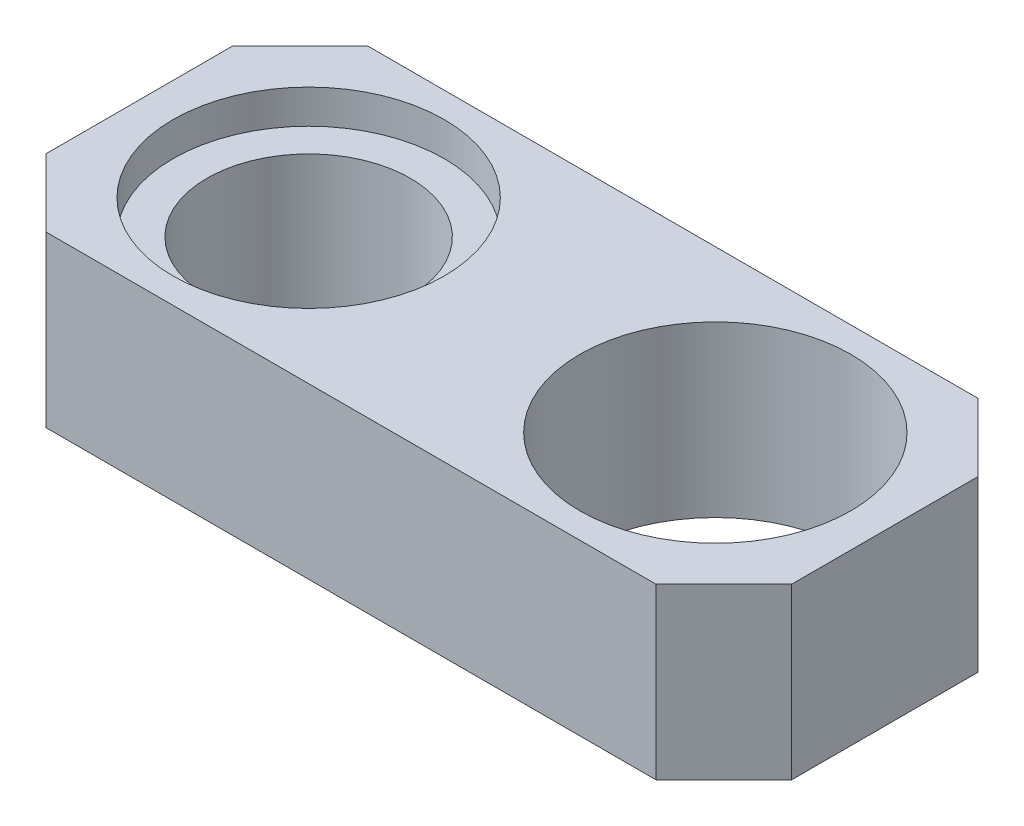
ISO-10303-21;
HEADER;
FILE_DESCRIPTION(('STEP AP214'),'2;1');
FILE_NAME('part.step','',(''),(''),'','','');
FILE_SCHEMA(('AUTOMOTIVE_DESIGN { 1 0 10303 214 1 1 1 1 }'));
ENDSEC;
DATA;
#1=APPLICATION_CONTEXT('core data for automotive mechanical design processes');
#2=APPLICATION_PROTOCOL_DEFINITION('international standard','automotive_design',2000,#1);
#3=PRODUCT_CONTEXT('',#1,'mechanical');
#4=PRODUCT('Part','Part','',(#3));
#5=PRODUCT_RELATED_PRODUCT_CATEGORY('part','',(#4));
#6=PRODUCT_DEFINITION_FORMATION('','',#4);
#7=PRODUCT_DEFINITION_CONTEXT('part definition',#1,'design');
#8=PRODUCT_DEFINITION('design','',#6,#7);
#9=PRODUCT_DEFINITION_SHAPE('','',#8);
#10=(LENGTH_UNIT() NAMED_UNIT(*) SI_UNIT(.MILLI.,.METRE.));
#11=(NAMED_UNIT(*) PLANE_ANGLE_UNIT() SI_UNIT($,.RADIAN.));
#12=(NAMED_UNIT(*) SI_UNIT($,.STERADIAN.) SOLID_ANGLE_UNIT());
#13=UNCERTAINTY_MEASURE_WITH_UNIT(LENGTH_MEASURE(1.E-05),#10,'distance_accuracy_value','');
#14=(GEOMETRIC_REPRESENTATION_CONTEXT(3) GLOBAL_UNCERTAINTY_ASSIGNED_CONTEXT((#13)) GLOBAL_UNIT_ASSIGNED_CONTEXT((#10,
#11,#12)) REPRESENTATION_CONTEXT('',''));
#15=CARTESIAN_POINT('',(0.,0.,0.));
#16=DIRECTION('',(0.,0.,1.));
#17=DIRECTION('',(1.,0.,0.));
#18=AXIS2_PLACEMENT_3D('',#15,#16,#17);
#19=CARTESIAN_POINT('',(-11.,2.5,4.75));
#20=DIRECTION('',(1.,0.,0.));
#21=DIRECTION('',(0.,0.,-1.));
#22=AXIS2_PLACEMENT_3D('',#19,#20,#21);
#23=PLANE('',#22);
#24=DIRECTION('',(0.,0.,1.));
#25=VECTOR('',#24,1.);
#26=CARTESIAN_POINT('',(-11.,2.5,4.75));
#27=LINE('',#26,#25);
#28=CARTESIAN_POINT('',(-11.,2.5,-2.75));
#29=VERTEX_POINT('',#28);
#30=CARTESIAN_POINT('',(-11.,2.5,2.74999999999999));
#31=VERTEX_POINT('',#30);
#32=EDGE_CURVE('E128',#29,#31,#27,.T.);
#33=ORIENTED_EDGE('',*,*,#32,.F.);
#34=DIRECTION('',(0.,-1.,0.));
#35=VECTOR('',#34,1.);
#36=CARTESIAN_POINT('',(-11.,2.5,-2.75));
#37=LINE('',#36,#35);
#38=CARTESIAN_POINT('',(-11.,-2.5,-2.75));
#39=VERTEX_POINT('',#38);
#40=EDGE_CURVE('E113',#29,#39,#37,.T.);
#41=ORIENTED_EDGE('',*,*,#40,.T.);
#42=DIRECTION('',(0.,0.,1.));
#43=VECTOR('',#42,1.);
#44=CARTESIAN_POINT('',(-11.,-2.5,4.75));
#45=LINE('',#44,#43);
#46=CARTESIAN_POINT('',(-11.,-2.5,2.74999999999999));
#47=VERTEX_POINT('',#46);
#48=EDGE_CURVE('E130',#39,#47,#45,.T.);
#49=ORIENTED_EDGE('',*,*,#48,.T.);
#50=DIRECTION('',(0.,1.,0.));
#51=VECTOR('',#50,1.);
#52=CARTESIAN_POINT('',(-11.,2.5,2.74999999999999));
#53=LINE('',#52,#51);
#54=EDGE_CURVE('E132',#47,#31,#53,.T.);
#55=ORIENTED_EDGE('',*,*,#54,.T.);
#56=EDGE_LOOP('',(#33,#41,#49,#55));
#57=FACE_BOUND('',#56,.T.);
#58=ADVANCED_FACE('F42',(#57),#23,.F.);
#59=CARTESIAN_POINT('',(11.,2.5,4.75));
#60=DIRECTION('',(0.,0.,-1.));
#61=DIRECTION('',(-1.,0.,0.));
#62=AXIS2_PLACEMENT_3D('',#59,#60,#61);
#63=PLANE('',#62);
#64=DIRECTION('',(1.,0.,0.));
#65=VECTOR('',#64,1.);
#66=CARTESIAN_POINT('',(11.,2.5,4.75));
#67=LINE('',#66,#65);
#68=CARTESIAN_POINT('',(-9.,2.5,4.75));
#69=VERTEX_POINT('',#68);
#70=CARTESIAN_POINT('',(8.99999999999999,2.5,4.75));
#71=VERTEX_POINT('',#70);
#72=EDGE_CURVE('E177',#69,#71,#67,.T.);
#73=ORIENTED_EDGE('',*,*,#72,.F.);
#74=DIRECTION('',(0.,-1.,0.));
#75=VECTOR('',#74,1.);
#76=CARTESIAN_POINT('',(-9.,2.5,4.75));
#77=LINE('',#76,#75);
#78=CARTESIAN_POINT('',(-9.,-2.5,4.75));
#79=VERTEX_POINT('',#78);
#80=EDGE_CURVE('E166',#69,#79,#77,.T.);
#81=ORIENTED_EDGE('',*,*,#80,.T.);
#82=DIRECTION('',(1.,0.,0.));
#83=VECTOR('',#82,1.);
#84=CARTESIAN_POINT('',(11.,-2.5,4.75));
#85=LINE('',#84,#83);
#86=CARTESIAN_POINT('',(8.99999999999999,-2.5,4.75));
#87=VERTEX_POINT('',#86);
#88=EDGE_CURVE('E137',#79,#87,#85,.T.);
#89=ORIENTED_EDGE('',*,*,#88,.T.);
#90=DIRECTION('',(0.,1.,0.));
#91=VECTOR('',#90,1.);
#92=CARTESIAN_POINT('',(8.99999999999999,2.5,4.75));
#93=LINE('',#92,#91);
#94=EDGE_CURVE('E170',#87,#71,#93,.T.);
#95=ORIENTED_EDGE('',*,*,#94,.T.);
#96=EDGE_LOOP('',(#73,#81,#89,#95));
#97=FACE_BOUND('',#96,.T.);
#98=ADVANCED_FACE('F173',(#97),#63,.F.);
#99=CARTESIAN_POINT('',(11.,2.5,4.75));
#100=DIRECTION('',(-1.,0.,0.));
#101=DIRECTION('',(0.,0.,1.));
#102=AXIS2_PLACEMENT_3D('',#99,#100,#101);
#103=PLANE('',#102);
#104=DIRECTION('',(0.,0.,-1.));
#105=VECTOR('',#104,1.);
#106=CARTESIAN_POINT('',(11.,2.5,4.75));
#107=LINE('',#106,#105);
#108=CARTESIAN_POINT('',(11.,2.5,2.75));
#109=VERTEX_POINT('',#108);
#110=CARTESIAN_POINT('',(11.,2.5,-2.75));
#111=VERTEX_POINT('',#110);
#112=EDGE_CURVE('E184',#109,#111,#107,.T.);
#113=ORIENTED_EDGE('',*,*,#112,.F.);
#114=DIRECTION('',(0.,-1.,0.));
#115=VECTOR('',#114,1.);
#116=CARTESIAN_POINT('',(11.,2.5,2.75));
#117=LINE('',#116,#115);
#118=CARTESIAN_POINT('',(11.,-2.5,2.75));
#119=VERTEX_POINT('',#118);
#120=EDGE_CURVE('E11',#109,#119,#117,.T.);
#121=ORIENTED_EDGE('',*,*,#120,.T.);
#122=DIRECTION('',(0.,0.,-1.));
#123=VECTOR('',#122,1.);
#124=CARTESIAN_POINT('',(11.,-2.5,4.75));
#125=LINE('',#124,#123);
#126=CARTESIAN_POINT('',(11.,-2.5,-2.75));
#127=VERTEX_POINT('',#126);
#128=EDGE_CURVE('E138',#119,#127,#125,.T.);
#129=ORIENTED_EDGE('',*,*,#128,.T.);
#130=DIRECTION('',(0.,1.,0.));
#131=VECTOR('',#130,1.);
#132=CARTESIAN_POINT('',(11.,2.5,-2.75));
#133=LINE('',#132,#131);
#134=EDGE_CURVE('E52',#127,#111,#133,.T.);
#135=ORIENTED_EDGE('',*,*,#134,.T.);
#136=EDGE_LOOP('',(#113,#121,#129,#135));
#137=FACE_BOUND('',#136,.T.);
#138=ADVANCED_FACE('F181',(#137),#103,.F.);
#139=CARTESIAN_POINT('',(11.,2.5,-4.75));
#140=DIRECTION('',(0.,0.,1.));
#141=DIRECTION('',(1.,0.,0.));
#142=AXIS2_PLACEMENT_3D('',#139,#140,#141);
#143=PLANE('',#142);
#144=DIRECTION('',(-1.,0.,0.));
#145=VECTOR('',#144,1.);
#146=CARTESIAN_POINT('',(11.,-2.5,-4.75));
#147=LINE('',#146,#145);
#148=CARTESIAN_POINT('',(9.,-2.5,-4.75));
#149=VERTEX_POINT('',#148);
#150=CARTESIAN_POINT('',(-8.99999999999999,-2.5,-4.75));
#151=VERTEX_POINT('',#150);
#152=EDGE_CURVE('E147',#149,#151,#147,.T.);
#153=ORIENTED_EDGE('',*,*,#152,.T.);
#154=DIRECTION('',(0.,1.,0.));
#155=VECTOR('',#154,1.);
#156=CARTESIAN_POINT('',(-8.99999999999999,2.5,-4.75));
#157=LINE('',#156,#155);
#158=CARTESIAN_POINT('',(-8.99999999999999,2.5,-4.75));
#159=VERTEX_POINT('',#158);
#160=EDGE_CURVE('E116',#151,#159,#157,.T.);
#161=ORIENTED_EDGE('',*,*,#160,.T.);
#162=DIRECTION('',(-1.,0.,0.));
#163=VECTOR('',#162,1.);
#164=CARTESIAN_POINT('',(11.,2.5,-4.75));
#165=LINE('',#164,#163);
#166=CARTESIAN_POINT('',(9.,2.5,-4.75));
#167=VERTEX_POINT('',#166);
#168=EDGE_CURVE('E148',#167,#159,#165,.T.);
#169=ORIENTED_EDGE('',*,*,#168,.F.);
#170=DIRECTION('',(0.,-1.,0.));
#171=VECTOR('',#170,1.);
#172=CARTESIAN_POINT('',(9.,2.5,-4.75));
#173=LINE('',#172,#171);
#174=EDGE_CURVE('E122',#167,#149,#173,.T.);
#175=ORIENTED_EDGE('',*,*,#174,.T.);
#176=EDGE_LOOP('',(#153,#161,#169,#175));
#177=FACE_BOUND('',#176,.T.);
#178=ADVANCED_FACE('F228',(#177),#143,.F.);
#179=CARTESIAN_POINT('',(0.,2.5,0.));
#180=DIRECTION('',(0.,1.,0.));
#181=DIRECTION('',(0.,0.,1.));
#182=AXIS2_PLACEMENT_3D('',#179,#180,#181);
#183=PLANE('',#182);
#184=CARTESIAN_POINT('',(-6.,2.5,0.));
#185=DIRECTION('',(0.,1.,0.));
#186=DIRECTION('',(0.,0.,1.));
#187=AXIS2_PLACEMENT_3D('',#184,#185,#186);
#188=CIRCLE('',#187,4.);
#189=CARTESIAN_POINT('',(-6.,2.5,4.));
#190=VERTEX_POINT('',#189);
#191=EDGE_CURVE('E194',#190,#190,#188,.T.);
#192=ORIENTED_EDGE('',*,*,#191,.F.);
#193=EDGE_LOOP('',(#192));
#194=FACE_BOUND('',#193,.T.);
#195=CARTESIAN_POINT('',(6.,2.5,0.));
#196=DIRECTION('',(0.,1.,0.));
#197=DIRECTION('',(0.,0.,1.));
#198=AXIS2_PLACEMENT_3D('',#195,#196,#197);
#199=CIRCLE('',#198,4.);
#200=CARTESIAN_POINT('',(6.,2.5,4.));
#201=VERTEX_POINT('',#200);
#202=EDGE_CURVE('E141',#201,#201,#199,.T.);
#203=ORIENTED_EDGE('',*,*,#202,.F.);
#204=EDGE_LOOP('',(#203));
#205=FACE_BOUND('',#204,.T.);
#206=ORIENTED_EDGE('',*,*,#168,.T.);
#207=DIRECTION('',(0.707106781186549,0.,-0.707106781186546));
#208=VECTOR('',#207,1.);
#209=CARTESIAN_POINT('',(-6.87499999999998,2.5,-6.875));
#210=LINE('',#209,#208);
#211=EDGE_CURVE('E164',#159,#29,#210,.F.);
#212=ORIENTED_EDGE('',*,*,#211,.T.);
#213=ORIENTED_EDGE('',*,*,#32,.T.);
#214=DIRECTION('',(-0.707106781186546,0.,-0.707106781186549));
#215=VECTOR('',#214,1.);
#216=CARTESIAN_POINT('',(-6.87500000000002,2.5,6.87499999999999));
#217=LINE('',#216,#215);
#218=EDGE_CURVE('E162',#31,#69,#217,.F.);
#219=ORIENTED_EDGE('',*,*,#218,.T.);
#220=ORIENTED_EDGE('',*,*,#72,.T.);
#221=DIRECTION('',(-0.707106781186549,0.,0.707106781186546));
#222=VECTOR('',#221,1.);
#223=CARTESIAN_POINT('',(6.87499999999998,2.5,6.87500000000001));
#224=LINE('',#223,#222);
#225=EDGE_CURVE('E67',#71,#109,#224,.F.);
#226=ORIENTED_EDGE('',*,*,#225,.T.);
#227=ORIENTED_EDGE('',*,*,#112,.T.);
#228=DIRECTION('',(0.707106781186546,0.,0.707106781186549));
#229=VECTOR('',#228,1.);
#230=CARTESIAN_POINT('',(6.87500000000002,2.5,-6.87499999999999));
#231=LINE('',#230,#229);
#232=EDGE_CURVE('E159',#111,#167,#231,.F.);
#233=ORIENTED_EDGE('',*,*,#232,.T.);
#234=EDGE_LOOP('',(#206,#212,#213,#219,#220,#226,#227,#233));
#235=FACE_BOUND('',#234,.T.);
#236=ADVANCED_FACE('F226',(#194,#205,#235),#183,.T.);
#237=CARTESIAN_POINT('',(0.,-2.5,0.));
#238=DIRECTION('',(0.,1.,0.));
#239=DIRECTION('',(0.,0.,1.));
#240=AXIS2_PLACEMENT_3D('',#237,#238,#239);
#241=PLANE('',#240);
#242=CARTESIAN_POINT('',(-6.,-2.5,0.));
#243=DIRECTION('',(0.,1.,0.));
#244=DIRECTION('',(0.,0.,1.));
#245=AXIS2_PLACEMENT_3D('',#242,#243,#244);
#246=CIRCLE('',#245,3.);
#247=CARTESIAN_POINT('',(-6.,-2.5,3.));
#248=VERTEX_POINT('',#247);
#249=EDGE_CURVE('E198',#248,#248,#246,.T.);
#250=ORIENTED_EDGE('',*,*,#249,.T.);
#251=EDGE_LOOP('',(#250));
#252=FACE_BOUND('',#251,.T.);
#253=CARTESIAN_POINT('',(6.,-2.5,0.));
#254=DIRECTION('',(0.,1.,0.));
#255=DIRECTION('',(0.,0.,1.));
#256=AXIS2_PLACEMENT_3D('',#253,#254,#255);
#257=CIRCLE('',#256,4.);
#258=CARTESIAN_POINT('',(6.,-2.5,4.));
#259=VERTEX_POINT('',#258);
#260=EDGE_CURVE('E140',#259,#259,#257,.T.);
#261=ORIENTED_EDGE('',*,*,#260,.T.);
#262=EDGE_LOOP('',(#261));
#263=FACE_BOUND('',#262,.T.);
#264=ORIENTED_EDGE('',*,*,#48,.F.);
#265=DIRECTION('',(-0.707106781186549,0.,0.707106781186546));
#266=VECTOR('',#265,1.);
#267=CARTESIAN_POINT('',(-11.,-2.5,-2.75));
#268=LINE('',#267,#266);
#269=EDGE_CURVE('E112',#39,#151,#268,.F.);
#270=ORIENTED_EDGE('',*,*,#269,.T.);
#271=ORIENTED_EDGE('',*,*,#152,.F.);
#272=DIRECTION('',(-0.707106781186546,0.,-0.707106781186549));
#273=VECTOR('',#272,1.);
#274=CARTESIAN_POINT('',(9.,-2.5,-4.75));
#275=LINE('',#274,#273);
#276=EDGE_CURVE('E131',#149,#127,#275,.F.);
#277=ORIENTED_EDGE('',*,*,#276,.T.);
#278=ORIENTED_EDGE('',*,*,#128,.F.);
#279=DIRECTION('',(0.707106781186549,0.,-0.707106781186546));
#280=VECTOR('',#279,1.);
#281=CARTESIAN_POINT('',(11.,-2.5,2.75));
#282=LINE('',#281,#280);
#283=EDGE_CURVE('E152',#119,#87,#282,.F.);
#284=ORIENTED_EDGE('',*,*,#283,.T.);
#285=ORIENTED_EDGE('',*,*,#88,.F.);
#286=DIRECTION('',(0.707106781186546,0.,0.707106781186549));
#287=VECTOR('',#286,1.);
#288=CARTESIAN_POINT('',(-9.,-2.5,4.75));
#289=LINE('',#288,#287);
#290=EDGE_CURVE('E125',#79,#47,#289,.F.);
#291=ORIENTED_EDGE('',*,*,#290,.T.);
#292=EDGE_LOOP('',(#264,#270,#271,#277,#278,#284,#285,#291));
#293=FACE_BOUND('',#292,.T.);
#294=ADVANCED_FACE('F133',(#252,#263,#293),#241,.F.);
#295=CARTESIAN_POINT('',(6.,-2.5,0.));
#296=DIRECTION('',(0.,1.,0.));
#297=DIRECTION('',(0.,0.,1.));
#298=AXIS2_PLACEMENT_3D('',#295,#296,#297);
#299=CYLINDRICAL_SURFACE('',#298,4.);
#300=ORIENTED_EDGE('',*,*,#260,.F.);
#301=EDGE_LOOP('',(#300));
#302=FACE_BOUND('',#301,.T.);
#303=ORIENTED_EDGE('',*,*,#202,.T.);
#304=EDGE_LOOP('',(#303));
#305=FACE_BOUND('',#304,.T.);
#306=ADVANCED_FACE('F225',(#302,#305),#299,.F.);
#307=CARTESIAN_POINT('',(-6.,1.5,0.));
#308=DIRECTION('',(0.,1.,0.));
#309=DIRECTION('',(0.,0.,1.));
#310=AXIS2_PLACEMENT_3D('',#307,#308,#309);
#311=CYLINDRICAL_SURFACE('',#310,4.);
#312=CARTESIAN_POINT('',(-6.,1.5,0.));
#313=DIRECTION('',(0.,1.,0.));
#314=DIRECTION('',(0.,0.,1.));
#315=AXIS2_PLACEMENT_3D('',#312,#313,#314);
#316=CIRCLE('',#315,4.);
#317=CARTESIAN_POINT('',(-6.,1.5,4.));
#318=VERTEX_POINT('',#317);
#319=EDGE_CURVE('E192',#318,#318,#316,.T.);
#320=ORIENTED_EDGE('',*,*,#319,.F.);
#321=EDGE_LOOP('',(#320));
#322=FACE_BOUND('',#321,.T.);
#323=ORIENTED_EDGE('',*,*,#191,.T.);
#324=EDGE_LOOP('',(#323));
#325=FACE_BOUND('',#324,.T.);
#326=ADVANCED_FACE('F216',(#322,#325),#311,.F.);
#327=CARTESIAN_POINT('',(-6.,1.5,0.));
#328=DIRECTION('',(0.,1.,0.));
#329=DIRECTION('',(0.,0.,1.));
#330=AXIS2_PLACEMENT_3D('',#327,#328,#329);
#331=PLANE('',#330);
#332=CARTESIAN_POINT('',(-6.,1.5,0.));
#333=DIRECTION('',(0.,1.,0.));
#334=DIRECTION('',(0.,0.,1.));
#335=AXIS2_PLACEMENT_3D('',#332,#333,#334);
#336=CIRCLE('',#335,3.);
#337=CARTESIAN_POINT('',(-6.,1.5,3.));
#338=VERTEX_POINT('',#337);
#339=EDGE_CURVE('E200',#338,#338,#336,.T.);
#340=ORIENTED_EDGE('',*,*,#339,.F.);
#341=EDGE_LOOP('',(#340));
#342=FACE_BOUND('',#341,.T.);
#343=ORIENTED_EDGE('',*,*,#319,.T.);
#344=EDGE_LOOP('',(#343));
#345=FACE_BOUND('',#344,.T.);
#346=ADVANCED_FACE('F209',(#342,#345),#331,.T.);
#347=CARTESIAN_POINT('',(-6.,-2.5,0.));
#348=DIRECTION('',(0.,1.,0.));
#349=DIRECTION('',(0.,0.,1.));
#350=AXIS2_PLACEMENT_3D('',#347,#348,#349);
#351=CYLINDRICAL_SURFACE('',#350,3.);
#352=ORIENTED_EDGE('',*,*,#249,.F.);
#353=EDGE_LOOP('',(#352));
#354=FACE_BOUND('',#353,.T.);
#355=ORIENTED_EDGE('',*,*,#339,.T.);
#356=EDGE_LOOP('',(#355));
#357=FACE_BOUND('',#356,.T.);
#358=ADVANCED_FACE('F210',(#354,#357),#351,.F.);
#359=CARTESIAN_POINT('',(-11.,2.5,-2.75));
#360=DIRECTION('',(0.707106781186546,0.,0.707106781186549));
#361=DIRECTION('',(0.,-1.,0.));
#362=AXIS2_PLACEMENT_3D('',#359,#360,#361);
#363=PLANE('',#362);
#364=ORIENTED_EDGE('',*,*,#211,.F.);
#365=ORIENTED_EDGE('',*,*,#160,.F.);
#366=ORIENTED_EDGE('',*,*,#269,.F.);
#367=ORIENTED_EDGE('',*,*,#40,.F.);
#368=EDGE_LOOP('',(#364,#365,#366,#367));
#369=FACE_BOUND('',#368,.T.);
#370=ADVANCED_FACE('F111',(#369),#363,.F.);
#371=CARTESIAN_POINT('',(-9.,2.5,4.75));
#372=DIRECTION('',(0.707106781186549,0.,-0.707106781186546));
#373=DIRECTION('',(0.,-1.,0.));
#374=AXIS2_PLACEMENT_3D('',#371,#372,#373);
#375=PLANE('',#374);
#376=ORIENTED_EDGE('',*,*,#218,.F.);
#377=ORIENTED_EDGE('',*,*,#54,.F.);
#378=ORIENTED_EDGE('',*,*,#290,.F.);
#379=ORIENTED_EDGE('',*,*,#80,.F.);
#380=EDGE_LOOP('',(#376,#377,#378,#379));
#381=FACE_BOUND('',#380,.T.);
#382=ADVANCED_FACE('F238',(#381),#375,.F.);
#383=CARTESIAN_POINT('',(11.,2.5,2.75));
#384=DIRECTION('',(-0.707106781186546,0.,-0.707106781186549));
#385=DIRECTION('',(0.,-1.,0.));
#386=AXIS2_PLACEMENT_3D('',#383,#384,#385);
#387=PLANE('',#386);
#388=ORIENTED_EDGE('',*,*,#225,.F.);
#389=ORIENTED_EDGE('',*,*,#94,.F.);
#390=ORIENTED_EDGE('',*,*,#283,.F.);
#391=ORIENTED_EDGE('',*,*,#120,.F.);
#392=EDGE_LOOP('',(#388,#389,#390,#391));
#393=FACE_BOUND('',#392,.T.);
#394=ADVANCED_FACE('F185',(#393),#387,.F.);
#395=CARTESIAN_POINT('',(9.,2.5,-4.75));
#396=DIRECTION('',(-0.707106781186549,0.,0.707106781186546));
#397=DIRECTION('',(0.,-1.,0.));
#398=AXIS2_PLACEMENT_3D('',#395,#396,#397);
#399=PLANE('',#398);
#400=ORIENTED_EDGE('',*,*,#232,.F.);
#401=ORIENTED_EDGE('',*,*,#134,.F.);
#402=ORIENTED_EDGE('',*,*,#276,.F.);
#403=ORIENTED_EDGE('',*,*,#174,.F.);
#404=EDGE_LOOP('',(#400,#401,#402,#403));
#405=FACE_BOUND('',#404,.T.);
#406=ADVANCED_FACE('F50',(#405),#399,.F.);
#407=CLOSED_SHELL('',(#58,#98,#138,#178,#236,#294,#306,#326,#346,#358,#370,#382,#394,#406));
#408=MANIFOLD_SOLID_BREP('B2',#407);
#409=ADVANCED_BREP_SHAPE_REPRESENTATION('',(#18,#408),#14);
#410=SHAPE_DEFINITION_REPRESENTATION(#9,#409);
ENDSEC;
END-ISO-10303-21;
